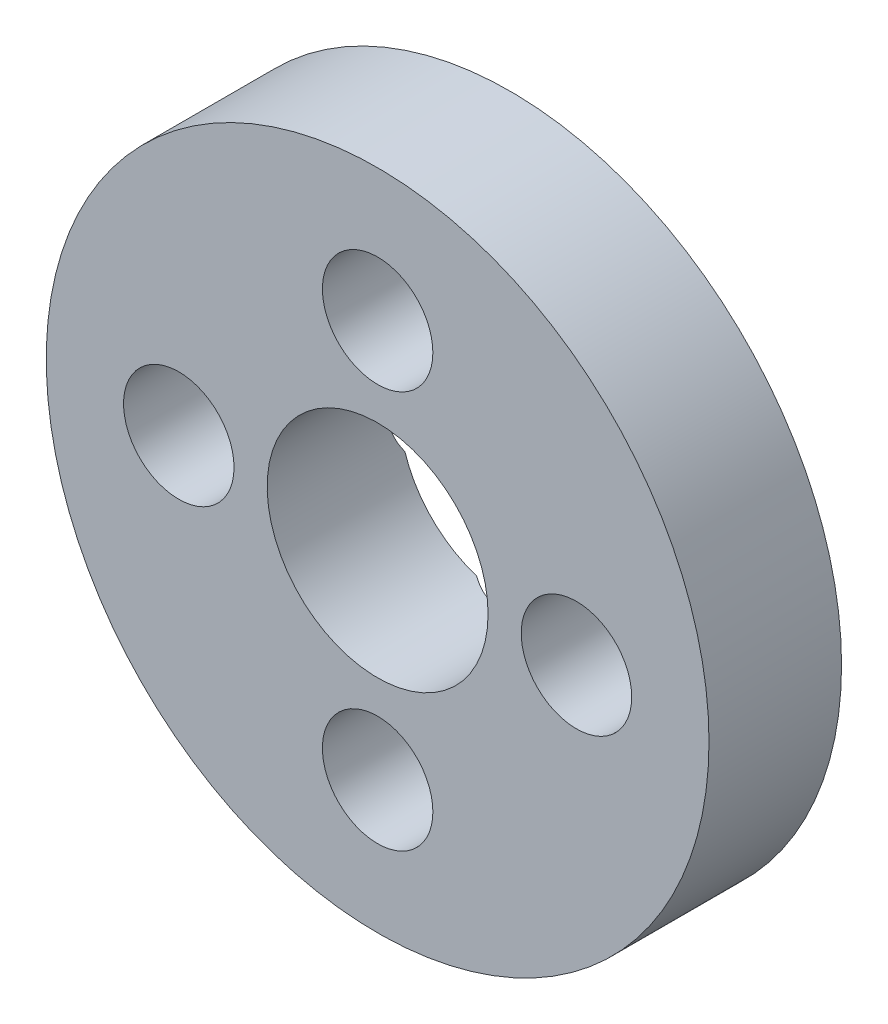
ISO-10303-21;
HEADER;
FILE_DESCRIPTION(('STEP AP214'),'2;1');
FILE_NAME('part.step','',(''),(''),'','','');
FILE_SCHEMA(('AUTOMOTIVE_DESIGN { 1 0 10303 214 1 1 1 1 }'));
ENDSEC;
DATA;
#1=APPLICATION_CONTEXT('core data for automotive mechanical design processes');
#2=APPLICATION_PROTOCOL_DEFINITION('international standard','automotive_design',2000,#1);
#3=PRODUCT_CONTEXT('',#1,'mechanical');
#4=PRODUCT('Part','Part','',(#3));
#5=PRODUCT_RELATED_PRODUCT_CATEGORY('part','',(#4));
#6=PRODUCT_DEFINITION_FORMATION('','',#4);
#7=PRODUCT_DEFINITION_CONTEXT('part definition',#1,'design');
#8=PRODUCT_DEFINITION('design','',#6,#7);
#9=PRODUCT_DEFINITION_SHAPE('','',#8);
#10=(LENGTH_UNIT() NAMED_UNIT(*) SI_UNIT(.MILLI.,.METRE.));
#11=(NAMED_UNIT(*) PLANE_ANGLE_UNIT() SI_UNIT($,.RADIAN.));
#12=(NAMED_UNIT(*) SI_UNIT($,.STERADIAN.) SOLID_ANGLE_UNIT());
#13=UNCERTAINTY_MEASURE_WITH_UNIT(LENGTH_MEASURE(1.E-05),#10,'distance_accuracy_value','');
#14=(GEOMETRIC_REPRESENTATION_CONTEXT(3) GLOBAL_UNCERTAINTY_ASSIGNED_CONTEXT((#13)) GLOBAL_UNIT_ASSIGNED_CONTEXT((#10,
#11,#12)) REPRESENTATION_CONTEXT('',''));
#15=CARTESIAN_POINT('',(0.,0.,0.));
#16=DIRECTION('',(0.,0.,1.));
#17=DIRECTION('',(1.,0.,0.));
#18=AXIS2_PLACEMENT_3D('',#15,#16,#17);
#19=CARTESIAN_POINT('',(0.,0.,3.));
#20=DIRECTION('',(0.,0.,1.));
#21=DIRECTION('',(1.,0.,0.));
#22=AXIS2_PLACEMENT_3D('',#19,#20,#21);
#23=PLANE('',#22);
#24=CARTESIAN_POINT('',(0.,4.5,3.));
#25=DIRECTION('',(0.,0.,1.));
#26=DIRECTION('',(1.,0.,0.));
#27=AXIS2_PLACEMENT_3D('',#24,#25,#26);
#28=CIRCLE('',#27,1.25);
#29=CARTESIAN_POINT('',(1.25,4.5,3.));
#30=VERTEX_POINT('',#29);
#31=EDGE_CURVE('E112',#30,#30,#28,.T.);
#32=ORIENTED_EDGE('',*,*,#31,.F.);
#33=EDGE_LOOP('',(#32));
#34=FACE_BOUND('',#33,.T.);
#35=CARTESIAN_POINT('',(4.5,0.,3.));
#36=DIRECTION('',(0.,0.,1.));
#37=DIRECTION('',(1.,0.,0.));
#38=AXIS2_PLACEMENT_3D('',#35,#36,#37);
#39=CIRCLE('',#38,1.25);
#40=CARTESIAN_POINT('',(5.75,0.,3.));
#41=VERTEX_POINT('',#40);
#42=EDGE_CURVE('E115',#41,#41,#39,.T.);
#43=ORIENTED_EDGE('',*,*,#42,.F.);
#44=EDGE_LOOP('',(#43));
#45=FACE_BOUND('',#44,.T.);
#46=CARTESIAN_POINT('',(0.,-4.5,3.));
#47=DIRECTION('',(0.,0.,1.));
#48=DIRECTION('',(1.,0.,0.));
#49=AXIS2_PLACEMENT_3D('',#46,#47,#48);
#50=CIRCLE('',#49,1.25);
#51=CARTESIAN_POINT('',(1.24999999999997,-4.5,3.));
#52=VERTEX_POINT('',#51);
#53=EDGE_CURVE('E120',#52,#52,#50,.T.);
#54=ORIENTED_EDGE('',*,*,#53,.F.);
#55=EDGE_LOOP('',(#54));
#56=FACE_BOUND('',#55,.T.);
#57=CARTESIAN_POINT('',(-4.5,0.,3.));
#58=DIRECTION('',(0.,0.,1.));
#59=DIRECTION('',(1.,0.,0.));
#60=AXIS2_PLACEMENT_3D('',#57,#58,#59);
#61=CIRCLE('',#60,1.25000000000005);
#62=CARTESIAN_POINT('',(-3.24999999999995,0.,3.));
#63=VERTEX_POINT('',#62);
#64=EDGE_CURVE('E125',#63,#63,#61,.T.);
#65=ORIENTED_EDGE('',*,*,#64,.F.);
#66=EDGE_LOOP('',(#65));
#67=FACE_BOUND('',#66,.T.);
#68=CARTESIAN_POINT('',(0.,0.,3.));
#69=DIRECTION('',(0.,0.,1.));
#70=DIRECTION('',(1.,0.,0.));
#71=AXIS2_PLACEMENT_3D('',#68,#69,#70);
#72=CIRCLE('',#71,7.5);
#73=CARTESIAN_POINT('',(7.5,0.,3.));
#74=VERTEX_POINT('',#73);
#75=EDGE_CURVE('E138',#74,#74,#72,.T.);
#76=ORIENTED_EDGE('',*,*,#75,.T.);
#77=EDGE_LOOP('',(#76));
#78=FACE_BOUND('',#77,.T.);
#79=CARTESIAN_POINT('',(0.,0.,3.));
#80=DIRECTION('',(0.,0.,1.));
#81=DIRECTION('',(1.,0.,0.));
#82=AXIS2_PLACEMENT_3D('',#79,#80,#81);
#83=CIRCLE('',#82,2.5);
#84=CARTESIAN_POINT('',(2.5,0.,3.));
#85=VERTEX_POINT('',#84);
#86=EDGE_CURVE('E104',#85,#85,#83,.T.);
#87=ORIENTED_EDGE('',*,*,#86,.F.);
#88=EDGE_LOOP('',(#87));
#89=FACE_BOUND('',#88,.T.);
#90=ADVANCED_FACE('F42',(#34,#45,#56,#67,#78,#89),#23,.T.);
#91=CARTESIAN_POINT('',(0.,0.,0.));
#92=DIRECTION('',(0.,0.,1.));
#93=DIRECTION('',(1.,0.,0.));
#94=AXIS2_PLACEMENT_3D('',#91,#92,#93);
#95=PLANE('',#94);
#96=CARTESIAN_POINT('',(0.,0.,0.));
#97=DIRECTION('',(0.,0.,1.));
#98=DIRECTION('',(1.,0.,0.));
#99=AXIS2_PLACEMENT_3D('',#96,#97,#98);
#100=CIRCLE('',#99,7.5);
#101=CARTESIAN_POINT('',(7.5,0.,0.));
#102=VERTEX_POINT('',#101);
#103=EDGE_CURVE('E108',#102,#102,#100,.T.);
#104=ORIENTED_EDGE('',*,*,#103,.F.);
#105=EDGE_LOOP('',(#104));
#106=FACE_BOUND('',#105,.T.);
#107=CARTESIAN_POINT('',(0.,0.,0.));
#108=DIRECTION('',(0.,0.,1.));
#109=DIRECTION('',(1.,0.,0.));
#110=AXIS2_PLACEMENT_3D('',#107,#108,#109);
#111=CIRCLE('',#110,2.5);
#112=CARTESIAN_POINT('',(-0.759171037105763,2.38194444444445,0.));
#113=VERTEX_POINT('',#112);
#114=CARTESIAN_POINT('',(-2.38194444444442,0.759171037105836,0.));
#115=VERTEX_POINT('',#114);
#116=EDGE_CURVE('E105',#113,#115,#111,.T.);
#117=ORIENTED_EDGE('',*,*,#116,.T.);
#118=CARTESIAN_POINT('',(-4.5,0.,0.));
#119=DIRECTION('',(0.,0.,1.));
#120=DIRECTION('',(1.,0.,0.));
#121=AXIS2_PLACEMENT_3D('',#118,#119,#120);
#122=CIRCLE('',#121,2.25000000000004);
#123=CARTESIAN_POINT('',(-2.38194444444442,-0.759171037105837,0.));
#124=VERTEX_POINT('',#123);
#125=EDGE_CURVE('E216',#115,#124,#122,.T.);
#126=ORIENTED_EDGE('',*,*,#125,.T.);
#127=CARTESIAN_POINT('',(-0.759171037105779,-2.38194444444444,0.));
#128=VERTEX_POINT('',#127);
#129=EDGE_CURVE('E110',#124,#128,#111,.T.);
#130=ORIENTED_EDGE('',*,*,#129,.T.);
#131=CARTESIAN_POINT('',(0.,-4.5,0.));
#132=DIRECTION('',(0.,0.,1.));
#133=DIRECTION('',(1.,0.,0.));
#134=AXIS2_PLACEMENT_3D('',#131,#132,#133);
#135=CIRCLE('',#134,2.25);
#136=CARTESIAN_POINT('',(0.759171037105746,-2.38194444444445,0.));
#137=VERTEX_POINT('',#136);
#138=EDGE_CURVE('E98',#128,#137,#135,.T.);
#139=ORIENTED_EDGE('',*,*,#138,.T.);
#140=CARTESIAN_POINT('',(2.38194444444443,-0.759171037105804,0.));
#141=VERTEX_POINT('',#140);
#142=EDGE_CURVE('E97',#137,#141,#111,.T.);
#143=ORIENTED_EDGE('',*,*,#142,.T.);
#144=CARTESIAN_POINT('',(4.5,0.,0.));
#145=DIRECTION('',(0.,0.,1.));
#146=DIRECTION('',(1.,0.,0.));
#147=AXIS2_PLACEMENT_3D('',#144,#145,#146);
#148=CIRCLE('',#147,2.25000000000002);
#149=CARTESIAN_POINT('',(2.38194444444444,0.759171037105787,0.));
#150=VERTEX_POINT('',#149);
#151=EDGE_CURVE('E87',#141,#150,#148,.T.);
#152=ORIENTED_EDGE('',*,*,#151,.T.);
#153=CARTESIAN_POINT('',(0.759171037105763,2.38194444444445,0.));
#154=VERTEX_POINT('',#153);
#155=EDGE_CURVE('E95',#150,#154,#111,.T.);
#156=ORIENTED_EDGE('',*,*,#155,.T.);
#157=CARTESIAN_POINT('',(0.,4.5,0.));
#158=DIRECTION('',(0.,0.,1.));
#159=DIRECTION('',(1.,0.,0.));
#160=AXIS2_PLACEMENT_3D('',#157,#158,#159);
#161=CIRCLE('',#160,2.25);
#162=EDGE_CURVE('E99',#154,#113,#161,.T.);
#163=ORIENTED_EDGE('',*,*,#162,.T.);
#164=EDGE_LOOP('',(#117,#126,#130,#139,#143,#152,#156,#163));
#165=FACE_BOUND('',#164,.T.);
#166=ADVANCED_FACE('F93',(#106,#165),#95,.F.);
#167=CARTESIAN_POINT('',(0.,0.,3.));
#168=DIRECTION('',(0.,0.,-1.));
#169=DIRECTION('',(-1.,0.,0.));
#170=AXIS2_PLACEMENT_3D('',#167,#168,#169);
#171=CYLINDRICAL_SURFACE('',#170,7.5);
#172=ORIENTED_EDGE('',*,*,#75,.F.);
#173=EDGE_LOOP('',(#172));
#174=FACE_BOUND('',#173,.T.);
#175=ORIENTED_EDGE('',*,*,#103,.T.);
#176=EDGE_LOOP('',(#175));
#177=FACE_BOUND('',#176,.T.);
#178=ADVANCED_FACE('F142',(#174,#177),#171,.T.);
#179=CARTESIAN_POINT('',(0.,0.,3.));
#180=DIRECTION('',(0.,0.,-1.));
#181=DIRECTION('',(-1.,0.,0.));
#182=AXIS2_PLACEMENT_3D('',#179,#180,#181);
#183=CYLINDRICAL_SURFACE('',#182,2.5);
#184=ORIENTED_EDGE('',*,*,#86,.T.);
#185=EDGE_LOOP('',(#184));
#186=FACE_BOUND('',#185,.T.);
#187=ORIENTED_EDGE('',*,*,#129,.F.);
#188=CARTESIAN_POINT('',(-2.38194444444442,-0.759171037105837,0.));
#189=CARTESIAN_POINT('',(-2.40231985542264,-0.695263144525314,0.0406856686903491));
#190=CARTESIAN_POINT('',(-2.4207873539978,-0.628399645775069,0.0788009671444945));
#191=CARTESIAN_POINT('',(-2.45292452780528,-0.488262100288311,0.146484470769469));
#192=CARTESIAN_POINT('',(-2.46652235327835,-0.414910508769921,0.175923627289394));
#193=CARTESIAN_POINT('',(-2.48471975822933,-0.281917368107137,0.215833247962386));
#194=CARTESIAN_POINT('',(-2.49071334349122,-0.223374747893208,0.229194921139126));
#195=CARTESIAN_POINT('',(-2.49848999403381,-0.105031019213564,0.246585914091305));
#196=CARTESIAN_POINT('',(-2.5003035085491,-0.0452422337696796,0.250682718558763));
#197=CARTESIAN_POINT('',(-2.49961227287968,0.0742627164821768,0.249127794344751));
#198=CARTESIAN_POINT('',(-2.49710138768676,0.133978657643508,0.243462215804782));
#199=CARTESIAN_POINT('',(-2.48798457891734,0.251920562447471,0.223120803013921));
#200=CARTESIAN_POINT('',(-2.48134892992166,0.310132487097585,0.208379571830469));
#201=CARTESIAN_POINT('',(-2.46246214683594,0.437488027744466,0.167131046248316));
#202=CARTESIAN_POINT('',(-2.44923283316678,0.505810589238065,0.138624581901721));
#203=CARTESIAN_POINT('',(-2.41850563551616,0.636609363156723,0.074102829484403));
#204=CARTESIAN_POINT('',(-2.40107071284253,0.699154547712492,0.0381993417132395));
#205=CARTESIAN_POINT('',(-2.38194444444442,0.759171037105836,0.));
#206=B_SPLINE_CURVE_WITH_KNOTS('',3,(#188,#189,#190,#191,#192,#193,#194,#195,#196,#197,#198,
#199,#200,#201,#202,#203,#204,#205),.UNSPECIFIED.,.F.,.F.,(4,2,2,2,2,2,2,2,4),(0.,
0.236169722885515,0.47569291745072,0.655945559390151,0.834880965161543,1.01407043502082,
1.19456646227097,1.41933678487789,1.6409308566024),.UNSPECIFIED.);
#207=EDGE_CURVE('E177',#124,#115,#206,.T.);
#208=ORIENTED_EDGE('',*,*,#207,.T.);
#209=ORIENTED_EDGE('',*,*,#116,.F.);
#210=CARTESIAN_POINT('',(-0.759171037105763,2.38194444444445,0.));
#211=CARTESIAN_POINT('',(-0.695263144525244,2.40231985542266,0.0406856686903435));
#212=CARTESIAN_POINT('',(-0.628399645775002,2.42078735399782,0.0788009671444833));
#213=CARTESIAN_POINT('',(-0.488262100288253,2.45292452780529,0.146484470769447));
#214=CARTESIAN_POINT('',(-0.414910508769868,2.46652235327836,0.175923627289367));
#215=CARTESIAN_POINT('',(-0.28191736810709,2.48471975822934,0.215833247962352));
#216=CARTESIAN_POINT('',(-0.223374747893161,2.49071334349123,0.229194921139089));
#217=CARTESIAN_POINT('',(-0.105031019213518,2.49848999403381,0.246585914091263));
#218=CARTESIAN_POINT('',(-0.0452422337696346,2.50030350854911,0.250682718558719));
#219=CARTESIAN_POINT('',(0.0742627164822199,2.49961227287968,0.249127794344702));
#220=CARTESIAN_POINT('',(0.13397865764355,2.49710138768676,0.243462215804731));
#221=CARTESIAN_POINT('',(0.251920562447509,2.48798457891734,0.223120803013866));
#222=CARTESIAN_POINT('',(0.310132487097622,2.48134892992166,0.208379571830412));
#223=CARTESIAN_POINT('',(0.437488027744481,2.46246214683594,0.167131046248263));
#224=CARTESIAN_POINT('',(0.50581058923806,2.44923283316678,0.138624581901676));
#225=CARTESIAN_POINT('',(0.636609363156681,2.41850563551617,0.074102829484378));
#226=CARTESIAN_POINT('',(0.699154547712434,2.40107071284255,0.0381993417132268));
#227=CARTESIAN_POINT('',(0.759171037105763,2.38194444444445,0.));
#228=B_SPLINE_CURVE_WITH_KNOTS('',3,(#210,#211,#212,#213,#214,#215,#216,#217,#218,#219,#220,
#221,#222,#223,#224,#225,#226,#227),.UNSPECIFIED.,.F.,.F.,(4,2,2,2,2,2,2,2,4),(0.,
0.236169722885496,0.47569291745068,0.655945559390108,0.834880965161496,1.01407043502077,
1.19456646227091,1.41933678487777,1.64093085660222),.UNSPECIFIED.);
#229=EDGE_CURVE('E88',#113,#154,#228,.T.);
#230=ORIENTED_EDGE('',*,*,#229,.T.);
#231=ORIENTED_EDGE('',*,*,#155,.F.);
#232=CARTESIAN_POINT('',(2.38194444444444,0.759171037105787,0.));
#233=CARTESIAN_POINT('',(2.40231985542265,0.695263144525266,0.0406856686903459));
#234=CARTESIAN_POINT('',(2.42078735399781,0.628399645775022,0.078800967144488));
#235=CARTESIAN_POINT('',(2.45292452780529,0.488262100288268,0.146484470769456));
#236=CARTESIAN_POINT('',(2.46652235327836,0.41491050876988,0.175923627289378));
#237=CARTESIAN_POINT('',(2.48471975822934,0.281917368107097,0.215833247962365));
#238=CARTESIAN_POINT('',(2.49071334349123,0.223374747893168,0.229194921139104));
#239=CARTESIAN_POINT('',(2.49848999403381,0.105031019213523,0.246585914091279));
#240=CARTESIAN_POINT('',(2.50030350854911,0.0452422337696384,0.250682718558736));
#241=CARTESIAN_POINT('',(2.49961227287968,-0.0742627164822181,0.24912779434472));
#242=CARTESIAN_POINT('',(2.49710138768676,-0.133978657643549,0.243462215804749));
#243=CARTESIAN_POINT('',(2.48798457891734,-0.251920562447511,0.223120803013886));
#244=CARTESIAN_POINT('',(2.48134892992166,-0.310132487097625,0.208379571830432));
#245=CARTESIAN_POINT('',(2.46246214683594,-0.437488027744492,0.167131046248281));
#246=CARTESIAN_POINT('',(2.44923283316677,-0.505810589238077,0.138624581901691));
#247=CARTESIAN_POINT('',(2.41850563551616,-0.636609363156711,0.0741028294843863));
#248=CARTESIAN_POINT('',(2.40107071284254,-0.699154547712469,0.0381993417132311));
#249=CARTESIAN_POINT('',(2.38194444444443,-0.759171037105804,0.));
#250=B_SPLINE_CURVE_WITH_KNOTS('',3,(#232,#233,#234,#235,#236,#237,#238,#239,#240,#241,#242,
#243,#244,#245,#246,#247,#248,#249),.UNSPECIFIED.,.F.,.F.,(4,2,2,2,2,2,2,2,4),(0.,
0.236169722885506,0.475692917450701,0.655945559390132,0.834880965161524,1.01407043502081,
1.19456646227095,1.41933678487783,1.64093085660229),.UNSPECIFIED.);
#251=EDGE_CURVE('E59',#150,#141,#250,.T.);
#252=ORIENTED_EDGE('',*,*,#251,.T.);
#253=ORIENTED_EDGE('',*,*,#142,.F.);
#254=CARTESIAN_POINT('',(0.759171037105746,-2.38194444444445,0.));
#255=CARTESIAN_POINT('',(0.695263144525227,-2.40231985542267,0.0406856686903435));
#256=CARTESIAN_POINT('',(0.628399645774986,-2.42078735399782,0.0788009671444834));
#257=CARTESIAN_POINT('',(0.488262100288236,-2.45292452780529,0.146484470769448));
#258=CARTESIAN_POINT('',(0.414910508769851,-2.46652235327836,0.175923627289367));
#259=CARTESIAN_POINT('',(0.281917368107073,-2.48471975822934,0.215833247962352));
#260=CARTESIAN_POINT('',(0.223374747893144,-2.49071334349123,0.22919492113909));
#261=CARTESIAN_POINT('',(0.105031019213501,-2.49848999403381,0.246585914091263));
#262=CARTESIAN_POINT('',(0.0452422337696172,-2.50030350854911,0.250682718558719));
#263=CARTESIAN_POINT('',(-0.0742627164822373,-2.49961227287968,0.249127794344702));
#264=CARTESIAN_POINT('',(-0.133978657643568,-2.49710138768675,0.243462215804731));
#265=CARTESIAN_POINT('',(-0.251920562447527,-2.48798457891734,0.223120803013866));
#266=CARTESIAN_POINT('',(-0.310132487097639,-2.48134892992166,0.208379571830413));
#267=CARTESIAN_POINT('',(-0.437488027744498,-2.46246214683594,0.167131046248263));
#268=CARTESIAN_POINT('',(-0.505810589238077,-2.44923283316677,0.138624581901676));
#269=CARTESIAN_POINT('',(-0.636609363156698,-2.41850563551616,0.0741028294843782));
#270=CARTESIAN_POINT('',(-0.69915454771245,-2.40107071284254,0.0381993417132269));
#271=CARTESIAN_POINT('',(-0.759171037105779,-2.38194444444444,0.));
#272=B_SPLINE_CURVE_WITH_KNOTS('',3,(#254,#255,#256,#257,#258,#259,#260,#261,#262,#263,#264,
#265,#266,#267,#268,#269,#270,#271),.UNSPECIFIED.,.F.,.F.,(4,2,2,2,2,2,2,2,4),(0.,
0.236169722885496,0.47569291745068,0.655945559390108,0.834880965161496,1.01407043502077,
1.19456646227091,1.41933678487777,1.64093085660222),.UNSPECIFIED.);
#273=EDGE_CURVE('E66',#137,#128,#272,.T.);
#274=ORIENTED_EDGE('',*,*,#273,.T.);
#275=EDGE_LOOP('',(#187,#208,#209,#230,#231,#252,#253,#274));
#276=FACE_BOUND('',#275,.T.);
#277=ADVANCED_FACE('F102',(#186,#276),#183,.F.);
#278=CARTESIAN_POINT('',(-4.5,0.,-7.));
#279=DIRECTION('',(0.,0.,1.));
#280=DIRECTION('',(1.,0.,0.));
#281=AXIS2_PLACEMENT_3D('',#278,#279,#280);
#282=CYLINDRICAL_SURFACE('',#281,1.25000000000005);
#283=CARTESIAN_POINT('',(-4.5,0.,1.));
#284=DIRECTION('',(0.,0.,1.));
#285=DIRECTION('',(1.,0.,0.));
#286=AXIS2_PLACEMENT_3D('',#283,#284,#285);
#287=CIRCLE('',#286,1.25000000000005);
#288=CARTESIAN_POINT('',(-3.24999999999995,0.,1.));
#289=VERTEX_POINT('',#288);
#290=EDGE_CURVE('E209',#289,#289,#287,.F.);
#291=ORIENTED_EDGE('',*,*,#290,.T.);
#292=EDGE_LOOP('',(#291));
#293=FACE_BOUND('',#292,.T.);
#294=ORIENTED_EDGE('',*,*,#64,.T.);
#295=EDGE_LOOP('',(#294));
#296=FACE_BOUND('',#295,.T.);
#297=ADVANCED_FACE('F129',(#293,#296),#282,.F.);
#298=CARTESIAN_POINT('',(0.,-4.5,-7.));
#299=DIRECTION('',(0.,0.,1.));
#300=DIRECTION('',(1.,0.,0.));
#301=AXIS2_PLACEMENT_3D('',#298,#299,#300);
#302=CYLINDRICAL_SURFACE('',#301,1.25);
#303=CARTESIAN_POINT('',(0.,-4.5,1.));
#304=DIRECTION('',(0.,0.,1.));
#305=DIRECTION('',(1.,0.,0.));
#306=AXIS2_PLACEMENT_3D('',#303,#304,#305);
#307=CIRCLE('',#306,1.25);
#308=CARTESIAN_POINT('',(1.24999999999997,-4.5,1.));
#309=VERTEX_POINT('',#308);
#310=EDGE_CURVE('E207',#309,#309,#307,.F.);
#311=ORIENTED_EDGE('',*,*,#310,.T.);
#312=EDGE_LOOP('',(#311));
#313=FACE_BOUND('',#312,.T.);
#314=ORIENTED_EDGE('',*,*,#53,.T.);
#315=EDGE_LOOP('',(#314));
#316=FACE_BOUND('',#315,.T.);
#317=ADVANCED_FACE('F148',(#313,#316),#302,.F.);
#318=CARTESIAN_POINT('',(4.5,0.,-7.));
#319=DIRECTION('',(0.,0.,1.));
#320=DIRECTION('',(1.,0.,0.));
#321=AXIS2_PLACEMENT_3D('',#318,#319,#320);
#322=CYLINDRICAL_SURFACE('',#321,1.25);
#323=CARTESIAN_POINT('',(4.5,0.,1.00000000000001));
#324=DIRECTION('',(0.,0.,1.));
#325=DIRECTION('',(1.,0.,0.));
#326=AXIS2_PLACEMENT_3D('',#323,#324,#325);
#327=CIRCLE('',#326,1.25);
#328=CARTESIAN_POINT('',(5.75,0.,1.00000000000001));
#329=VERTEX_POINT('',#328);
#330=EDGE_CURVE('E52',#329,#329,#327,.F.);
#331=ORIENTED_EDGE('',*,*,#330,.T.);
#332=EDGE_LOOP('',(#331));
#333=FACE_BOUND('',#332,.T.);
#334=ORIENTED_EDGE('',*,*,#42,.T.);
#335=EDGE_LOOP('',(#334));
#336=FACE_BOUND('',#335,.T.);
#337=ADVANCED_FACE('F256',(#333,#336),#322,.F.);
#338=CARTESIAN_POINT('',(0.,4.5,-7.));
#339=DIRECTION('',(0.,0.,1.));
#340=DIRECTION('',(1.,0.,0.));
#341=AXIS2_PLACEMENT_3D('',#338,#339,#340);
#342=CYLINDRICAL_SURFACE('',#341,1.25);
#343=CARTESIAN_POINT('',(0.,4.5,1.));
#344=DIRECTION('',(0.,0.,1.));
#345=DIRECTION('',(1.,0.,0.));
#346=AXIS2_PLACEMENT_3D('',#343,#344,#345);
#347=CIRCLE('',#346,1.25);
#348=CARTESIAN_POINT('',(1.25,4.5,1.));
#349=VERTEX_POINT('',#348);
#350=EDGE_CURVE('E11',#349,#349,#347,.F.);
#351=ORIENTED_EDGE('',*,*,#350,.T.);
#352=EDGE_LOOP('',(#351));
#353=FACE_BOUND('',#352,.T.);
#354=ORIENTED_EDGE('',*,*,#31,.T.);
#355=EDGE_LOOP('',(#354));
#356=FACE_BOUND('',#355,.T.);
#357=ADVANCED_FACE('F265',(#353,#356),#342,.F.);
#358=CARTESIAN_POINT('',(-4.5,0.,0.));
#359=DIRECTION('',(0.,0.,-1.));
#360=DIRECTION('',(-1.,0.,0.));
#361=AXIS2_PLACEMENT_3D('',#358,#359,#360);
#362=CONICAL_SURFACE('',#361,2.25000000000004,0.785398163397447);
#363=ORIENTED_EDGE('',*,*,#290,.F.);
#364=EDGE_LOOP('',(#363));
#365=FACE_BOUND('',#364,.T.);
#366=ORIENTED_EDGE('',*,*,#207,.F.);
#367=ORIENTED_EDGE('',*,*,#125,.F.);
#368=EDGE_LOOP('',(#366,#367));
#369=FACE_BOUND('',#368,.T.);
#370=ADVANCED_FACE('F192',(#365,#369),#362,.F.);
#371=CARTESIAN_POINT('',(0.,-4.5,0.));
#372=DIRECTION('',(0.,0.,-1.));
#373=DIRECTION('',(-1.,0.,0.));
#374=AXIS2_PLACEMENT_3D('',#371,#372,#373);
#375=CONICAL_SURFACE('',#374,2.25,0.785398163397446);
#376=ORIENTED_EDGE('',*,*,#310,.F.);
#377=EDGE_LOOP('',(#376));
#378=FACE_BOUND('',#377,.T.);
#379=ORIENTED_EDGE('',*,*,#273,.F.);
#380=ORIENTED_EDGE('',*,*,#138,.F.);
#381=EDGE_LOOP('',(#379,#380));
#382=FACE_BOUND('',#381,.T.);
#383=ADVANCED_FACE('F185',(#378,#382),#375,.F.);
#384=CARTESIAN_POINT('',(4.5,0.,0.));
#385=DIRECTION('',(0.,0.,-1.));
#386=DIRECTION('',(-1.,0.,0.));
#387=AXIS2_PLACEMENT_3D('',#384,#385,#386);
#388=CONICAL_SURFACE('',#387,2.25000000000002,0.785398163397454);
#389=ORIENTED_EDGE('',*,*,#330,.F.);
#390=EDGE_LOOP('',(#389));
#391=FACE_BOUND('',#390,.T.);
#392=ORIENTED_EDGE('',*,*,#251,.F.);
#393=ORIENTED_EDGE('',*,*,#151,.F.);
#394=EDGE_LOOP('',(#392,#393));
#395=FACE_BOUND('',#394,.T.);
#396=ADVANCED_FACE('F86',(#391,#395),#388,.F.);
#397=CARTESIAN_POINT('',(0.,4.5,0.));
#398=DIRECTION('',(0.,0.,-1.));
#399=DIRECTION('',(-1.,0.,0.));
#400=AXIS2_PLACEMENT_3D('',#397,#398,#399);
#401=CONICAL_SURFACE('',#400,2.25,0.785398163397446);
#402=ORIENTED_EDGE('',*,*,#350,.F.);
#403=EDGE_LOOP('',(#402));
#404=FACE_BOUND('',#403,.T.);
#405=ORIENTED_EDGE('',*,*,#229,.F.);
#406=ORIENTED_EDGE('',*,*,#162,.F.);
#407=EDGE_LOOP('',(#405,#406));
#408=FACE_BOUND('',#407,.T.);
#409=ADVANCED_FACE('F45',(#404,#408),#401,.F.);
#410=CLOSED_SHELL('',(#90,#166,#178,#277,#297,#317,#337,#357,#370,#383,#396,#409));
#411=MANIFOLD_SOLID_BREP('B2',#410);
#412=ADVANCED_BREP_SHAPE_REPRESENTATION('',(#18,#411),#14);
#413=SHAPE_DEFINITION_REPRESENTATION(#9,#412);
ENDSEC;
END-ISO-10303-21;
